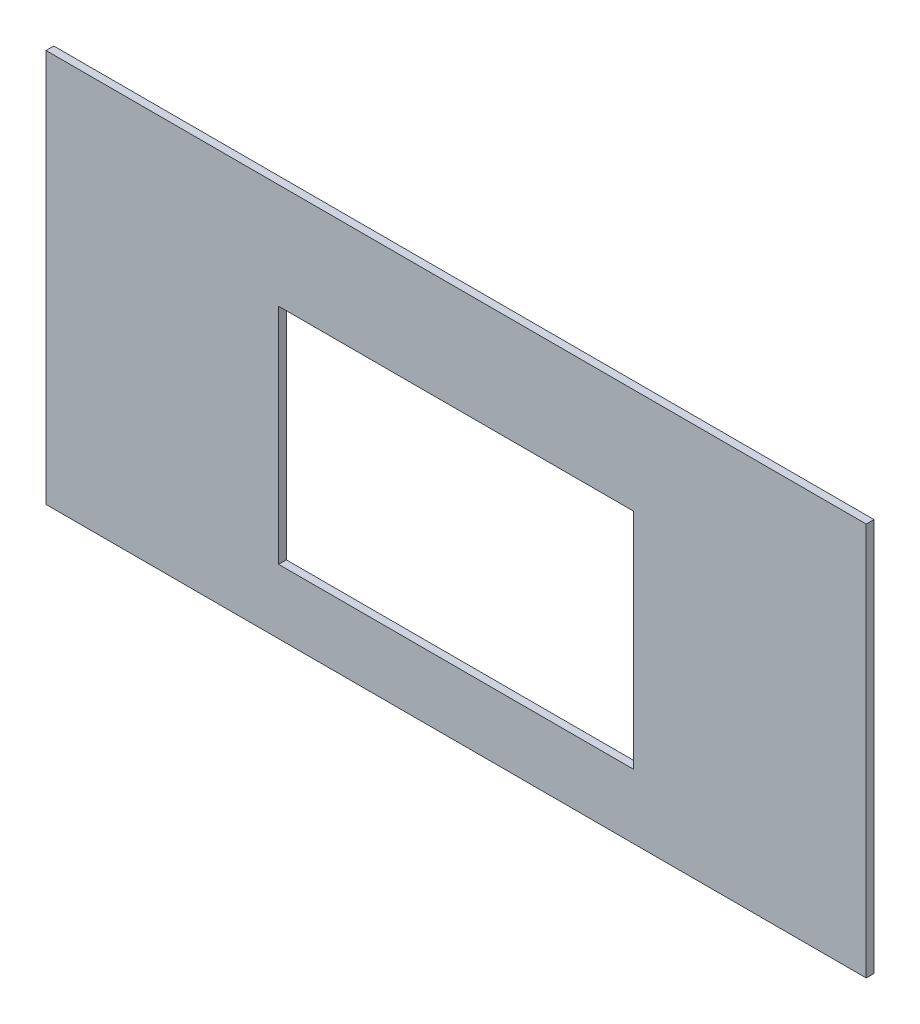
ISO-10303-21;
HEADER;
FILE_DESCRIPTION(('STEP AP214'),'2;1');
FILE_NAME('part.step','',(''),(''),'','','');
FILE_SCHEMA(('AUTOMOTIVE_DESIGN { 1 0 10303 214 1 1 1 1 }'));
ENDSEC;
DATA;
#1=APPLICATION_CONTEXT('core data for automotive mechanical design processes');
#2=APPLICATION_PROTOCOL_DEFINITION('international standard','automotive_design',2000,#1);
#3=PRODUCT_CONTEXT('',#1,'mechanical');
#4=PRODUCT('Part','Part','',(#3));
#5=PRODUCT_RELATED_PRODUCT_CATEGORY('part','',(#4));
#6=PRODUCT_DEFINITION_FORMATION('','',#4);
#7=PRODUCT_DEFINITION_CONTEXT('part definition',#1,'design');
#8=PRODUCT_DEFINITION('design','',#6,#7);
#9=PRODUCT_DEFINITION_SHAPE('','',#8);
#10=(LENGTH_UNIT() NAMED_UNIT(*) SI_UNIT(.MILLI.,.METRE.));
#11=(NAMED_UNIT(*) PLANE_ANGLE_UNIT() SI_UNIT($,.RADIAN.));
#12=(NAMED_UNIT(*) SI_UNIT($,.STERADIAN.) SOLID_ANGLE_UNIT());
#13=UNCERTAINTY_MEASURE_WITH_UNIT(LENGTH_MEASURE(1.E-05),#10,'distance_accuracy_value','');
#14=(GEOMETRIC_REPRESENTATION_CONTEXT(3) GLOBAL_UNCERTAINTY_ASSIGNED_CONTEXT((#13)) GLOBAL_UNIT_ASSIGNED_CONTEXT((#10,
#11,#12)) REPRESENTATION_CONTEXT('',''));
#15=CARTESIAN_POINT('',(0.,0.,0.));
#16=DIRECTION('',(0.,0.,1.));
#17=DIRECTION('',(1.,0.,0.));
#18=AXIS2_PLACEMENT_3D('',#15,#16,#17);
#19=CARTESIAN_POINT('',(31.19,14.95,0.59));
#20=DIRECTION('',(-1.,0.,0.));
#21=DIRECTION('',(0.,0.,1.));
#22=AXIS2_PLACEMENT_3D('',#19,#20,#21);
#23=PLANE('',#22);
#24=DIRECTION('',(0.,1.,0.));
#25=VECTOR('',#24,1.);
#26=CARTESIAN_POINT('',(31.19,14.95,0.));
#27=LINE('',#26,#25);
#28=CARTESIAN_POINT('',(31.19,-14.95,0.));
#29=VERTEX_POINT('',#28);
#30=CARTESIAN_POINT('',(31.19,14.95,0.));
#31=VERTEX_POINT('',#30);
#32=EDGE_CURVE('E123',#29,#31,#27,.T.);
#33=ORIENTED_EDGE('',*,*,#32,.T.);
#34=DIRECTION('',(0.,0.,-1.));
#35=VECTOR('',#34,1.);
#36=CARTESIAN_POINT('',(31.19,14.95,0.59));
#37=LINE('',#36,#35);
#38=CARTESIAN_POINT('',(31.19,14.95,0.59));
#39=VERTEX_POINT('',#38);
#40=EDGE_CURVE('E152',#39,#31,#37,.T.);
#41=ORIENTED_EDGE('',*,*,#40,.F.);
#42=DIRECTION('',(0.,1.,0.));
#43=VECTOR('',#42,1.);
#44=CARTESIAN_POINT('',(31.19,14.95,0.59));
#45=LINE('',#44,#43);
#46=CARTESIAN_POINT('',(31.19,-14.95,0.59));
#47=VERTEX_POINT('',#46);
#48=EDGE_CURVE('E126',#47,#39,#45,.T.);
#49=ORIENTED_EDGE('',*,*,#48,.F.);
#50=DIRECTION('',(0.,0.,-1.));
#51=VECTOR('',#50,1.);
#52=CARTESIAN_POINT('',(31.19,-14.95,0.59));
#53=LINE('',#52,#51);
#54=EDGE_CURVE('E136',#47,#29,#53,.T.);
#55=ORIENTED_EDGE('',*,*,#54,.T.);
#56=EDGE_LOOP('',(#33,#41,#49,#55));
#57=FACE_BOUND('',#56,.T.);
#58=ADVANCED_FACE('F33',(#57),#23,.F.);
#59=CARTESIAN_POINT('',(-31.19,14.95,0.59));
#60=DIRECTION('',(0.,-1.,0.));
#61=DIRECTION('',(0.,0.,-1.));
#62=AXIS2_PLACEMENT_3D('',#59,#60,#61);
#63=PLANE('',#62);
#64=DIRECTION('',(-1.,0.,0.));
#65=VECTOR('',#64,1.);
#66=CARTESIAN_POINT('',(-31.19,14.95,0.));
#67=LINE('',#66,#65);
#68=CARTESIAN_POINT('',(-31.19,14.95,0.));
#69=VERTEX_POINT('',#68);
#70=EDGE_CURVE('E139',#31,#69,#67,.T.);
#71=ORIENTED_EDGE('',*,*,#70,.T.);
#72=DIRECTION('',(0.,0.,-1.));
#73=VECTOR('',#72,1.);
#74=CARTESIAN_POINT('',(-31.19,14.95,0.59));
#75=LINE('',#74,#73);
#76=CARTESIAN_POINT('',(-31.19,14.95,0.59));
#77=VERTEX_POINT('',#76);
#78=EDGE_CURVE('E149',#77,#69,#75,.T.);
#79=ORIENTED_EDGE('',*,*,#78,.F.);
#80=DIRECTION('',(-1.,0.,0.));
#81=VECTOR('',#80,1.);
#82=CARTESIAN_POINT('',(-31.19,14.95,0.59));
#83=LINE('',#82,#81);
#84=EDGE_CURVE('E129',#39,#77,#83,.T.);
#85=ORIENTED_EDGE('',*,*,#84,.F.);
#86=ORIENTED_EDGE('',*,*,#40,.T.);
#87=EDGE_LOOP('',(#71,#79,#85,#86));
#88=FACE_BOUND('',#87,.T.);
#89=ADVANCED_FACE('F176',(#88),#63,.F.);
#90=CARTESIAN_POINT('',(-31.19,14.95,0.59));
#91=DIRECTION('',(1.,0.,0.));
#92=DIRECTION('',(0.,1.,0.));
#93=AXIS2_PLACEMENT_3D('',#90,#91,#92);
#94=PLANE('',#93);
#95=DIRECTION('',(0.,-1.,0.));
#96=VECTOR('',#95,1.);
#97=CARTESIAN_POINT('',(-31.19,14.95,0.));
#98=LINE('',#97,#96);
#99=CARTESIAN_POINT('',(-31.19,-14.95,0.));
#100=VERTEX_POINT('',#99);
#101=EDGE_CURVE('E141',#69,#100,#98,.T.);
#102=ORIENTED_EDGE('',*,*,#101,.T.);
#103=DIRECTION('',(0.,0.,-1.));
#104=VECTOR('',#103,1.);
#105=CARTESIAN_POINT('',(-31.19,-14.95,0.59));
#106=LINE('',#105,#104);
#107=CARTESIAN_POINT('',(-31.19,-14.95,0.59));
#108=VERTEX_POINT('',#107);
#109=EDGE_CURVE('E146',#108,#100,#106,.T.);
#110=ORIENTED_EDGE('',*,*,#109,.F.);
#111=DIRECTION('',(0.,-1.,0.));
#112=VECTOR('',#111,1.);
#113=CARTESIAN_POINT('',(-31.19,14.95,0.59));
#114=LINE('',#113,#112);
#115=EDGE_CURVE('E132',#77,#108,#114,.T.);
#116=ORIENTED_EDGE('',*,*,#115,.F.);
#117=ORIENTED_EDGE('',*,*,#78,.T.);
#118=EDGE_LOOP('',(#102,#110,#116,#117));
#119=FACE_BOUND('',#118,.T.);
#120=ADVANCED_FACE('F181',(#119),#94,.F.);
#121=CARTESIAN_POINT('',(-31.19,-14.95,0.59));
#122=DIRECTION('',(0.,1.,0.));
#123=DIRECTION('',(0.,0.,1.));
#124=AXIS2_PLACEMENT_3D('',#121,#122,#123);
#125=PLANE('',#124);
#126=DIRECTION('',(1.,0.,0.));
#127=VECTOR('',#126,1.);
#128=CARTESIAN_POINT('',(-31.19,-14.95,0.));
#129=LINE('',#128,#127);
#130=EDGE_CURVE('E130',#100,#29,#129,.T.);
#131=ORIENTED_EDGE('',*,*,#130,.T.);
#132=ORIENTED_EDGE('',*,*,#54,.F.);
#133=DIRECTION('',(1.,0.,0.));
#134=VECTOR('',#133,1.);
#135=CARTESIAN_POINT('',(-31.19,-14.95,0.59));
#136=LINE('',#135,#134);
#137=EDGE_CURVE('E134',#108,#47,#136,.T.);
#138=ORIENTED_EDGE('',*,*,#137,.F.);
#139=ORIENTED_EDGE('',*,*,#109,.T.);
#140=EDGE_LOOP('',(#131,#132,#138,#139));
#141=FACE_BOUND('',#140,.T.);
#142=ADVANCED_FACE('F194',(#141),#125,.F.);
#143=CARTESIAN_POINT('',(0.,0.,0.59));
#144=DIRECTION('',(0.,0.,1.));
#145=DIRECTION('',(1.,0.,0.));
#146=AXIS2_PLACEMENT_3D('',#143,#144,#145);
#147=PLANE('',#146);
#148=DIRECTION('',(0.,1.,0.));
#149=VECTOR('',#148,1.);
#150=CARTESIAN_POINT('',(13.5,6.95000000000001,0.59));
#151=LINE('',#150,#149);
#152=CARTESIAN_POINT('',(13.5,-10.05,0.59));
#153=VERTEX_POINT('',#152);
#154=CARTESIAN_POINT('',(13.5,6.95000000000001,0.59));
#155=VERTEX_POINT('',#154);
#156=EDGE_CURVE('E47',#153,#155,#151,.T.);
#157=ORIENTED_EDGE('',*,*,#156,.F.);
#158=DIRECTION('',(1.,0.,0.));
#159=VECTOR('',#158,1.);
#160=CARTESIAN_POINT('',(-13.5,-10.05,0.59));
#161=LINE('',#160,#159);
#162=CARTESIAN_POINT('',(-13.5,-10.05,0.59));
#163=VERTEX_POINT('',#162);
#164=EDGE_CURVE('E116',#163,#153,#161,.T.);
#165=ORIENTED_EDGE('',*,*,#164,.F.);
#166=DIRECTION('',(0.,-1.,0.));
#167=VECTOR('',#166,1.);
#168=CARTESIAN_POINT('',(-13.5,6.95000000000001,0.59));
#169=LINE('',#168,#167);
#170=CARTESIAN_POINT('',(-13.5,6.95000000000001,0.59));
#171=VERTEX_POINT('',#170);
#172=EDGE_CURVE('E100',#171,#163,#169,.T.);
#173=ORIENTED_EDGE('',*,*,#172,.F.);
#174=DIRECTION('',(-1.,0.,0.));
#175=VECTOR('',#174,1.);
#176=CARTESIAN_POINT('',(-13.5,6.95000000000001,0.59));
#177=LINE('',#176,#175);
#178=EDGE_CURVE('E109',#155,#171,#177,.T.);
#179=ORIENTED_EDGE('',*,*,#178,.F.);
#180=EDGE_LOOP('',(#157,#165,#173,#179));
#181=FACE_BOUND('',#180,.T.);
#182=ORIENTED_EDGE('',*,*,#48,.T.);
#183=ORIENTED_EDGE('',*,*,#84,.T.);
#184=ORIENTED_EDGE('',*,*,#115,.T.);
#185=ORIENTED_EDGE('',*,*,#137,.T.);
#186=EDGE_LOOP('',(#182,#183,#184,#185));
#187=FACE_BOUND('',#186,.T.);
#188=ADVANCED_FACE('F113',(#181,#187),#147,.T.);
#189=CARTESIAN_POINT('',(0.,0.,0.));
#190=DIRECTION('',(0.,0.,1.));
#191=DIRECTION('',(1.,0.,0.));
#192=AXIS2_PLACEMENT_3D('',#189,#190,#191);
#193=PLANE('',#192);
#194=DIRECTION('',(1.,0.,0.));
#195=VECTOR('',#194,1.);
#196=CARTESIAN_POINT('',(0.,-10.05,0.));
#197=LINE('',#196,#195);
#198=CARTESIAN_POINT('',(-13.5,-10.05,0.));
#199=VERTEX_POINT('',#198);
#200=CARTESIAN_POINT('',(13.5,-10.05,0.));
#201=VERTEX_POINT('',#200);
#202=EDGE_CURVE('E40',#199,#201,#197,.T.);
#203=ORIENTED_EDGE('',*,*,#202,.T.);
#204=DIRECTION('',(0.,1.,0.));
#205=VECTOR('',#204,1.);
#206=CARTESIAN_POINT('',(13.5,0.,0.));
#207=LINE('',#206,#205);
#208=CARTESIAN_POINT('',(13.5,6.95000000000001,0.));
#209=VERTEX_POINT('',#208);
#210=EDGE_CURVE('E11',#201,#209,#207,.T.);
#211=ORIENTED_EDGE('',*,*,#210,.T.);
#212=DIRECTION('',(-1.,0.,0.));
#213=VECTOR('',#212,1.);
#214=CARTESIAN_POINT('',(0.,6.95000000000001,0.));
#215=LINE('',#214,#213);
#216=CARTESIAN_POINT('',(-13.5,6.95000000000001,0.));
#217=VERTEX_POINT('',#216);
#218=EDGE_CURVE('E155',#209,#217,#215,.T.);
#219=ORIENTED_EDGE('',*,*,#218,.T.);
#220=DIRECTION('',(0.,-1.,0.));
#221=VECTOR('',#220,1.);
#222=CARTESIAN_POINT('',(-13.5,0.,0.));
#223=LINE('',#222,#221);
#224=EDGE_CURVE('E103',#217,#199,#223,.T.);
#225=ORIENTED_EDGE('',*,*,#224,.T.);
#226=EDGE_LOOP('',(#203,#211,#219,#225));
#227=FACE_BOUND('',#226,.T.);
#228=ORIENTED_EDGE('',*,*,#32,.F.);
#229=ORIENTED_EDGE('',*,*,#130,.F.);
#230=ORIENTED_EDGE('',*,*,#101,.F.);
#231=ORIENTED_EDGE('',*,*,#70,.F.);
#232=EDGE_LOOP('',(#228,#229,#230,#231));
#233=FACE_BOUND('',#232,.T.);
#234=ADVANCED_FACE('F159',(#227,#233),#193,.F.);
#235=CARTESIAN_POINT('',(13.5,6.95000000000001,-0.41));
#236=DIRECTION('',(1.,0.,0.));
#237=DIRECTION('',(0.,1.,0.));
#238=AXIS2_PLACEMENT_3D('',#235,#236,#237);
#239=PLANE('',#238);
#240=DIRECTION('',(0.,0.,1.));
#241=VECTOR('',#240,1.);
#242=CARTESIAN_POINT('',(13.5,-10.05,-0.41));
#243=LINE('',#242,#241);
#244=EDGE_CURVE('E121',#201,#153,#243,.T.);
#245=ORIENTED_EDGE('',*,*,#244,.T.);
#246=ORIENTED_EDGE('',*,*,#156,.T.);
#247=DIRECTION('',(0.,0.,1.));
#248=VECTOR('',#247,1.);
#249=CARTESIAN_POINT('',(13.5,6.95000000000001,-0.41));
#250=LINE('',#249,#248);
#251=EDGE_CURVE('E106',#209,#155,#250,.T.);
#252=ORIENTED_EDGE('',*,*,#251,.F.);
#253=ORIENTED_EDGE('',*,*,#210,.F.);
#254=EDGE_LOOP('',(#245,#246,#252,#253));
#255=FACE_BOUND('',#254,.T.);
#256=ADVANCED_FACE('F164',(#255),#239,.F.);
#257=CARTESIAN_POINT('',(-13.5,-10.05,-0.41));
#258=DIRECTION('',(0.,-1.,0.));
#259=DIRECTION('',(1.,0.,0.));
#260=AXIS2_PLACEMENT_3D('',#257,#258,#259);
#261=PLANE('',#260);
#262=DIRECTION('',(0.,0.,1.));
#263=VECTOR('',#262,1.);
#264=CARTESIAN_POINT('',(-13.5,-10.05,-0.41));
#265=LINE('',#264,#263);
#266=EDGE_CURVE('E105',#199,#163,#265,.T.);
#267=ORIENTED_EDGE('',*,*,#266,.T.);
#268=ORIENTED_EDGE('',*,*,#164,.T.);
#269=ORIENTED_EDGE('',*,*,#244,.F.);
#270=ORIENTED_EDGE('',*,*,#202,.F.);
#271=EDGE_LOOP('',(#267,#268,#269,#270));
#272=FACE_BOUND('',#271,.T.);
#273=ADVANCED_FACE('F163',(#272),#261,.F.);
#274=CARTESIAN_POINT('',(-13.5,6.95000000000001,-0.41));
#275=DIRECTION('',(-1.,0.,0.));
#276=DIRECTION('',(0.,0.,1.));
#277=AXIS2_PLACEMENT_3D('',#274,#275,#276);
#278=PLANE('',#277);
#279=DIRECTION('',(0.,0.,1.));
#280=VECTOR('',#279,1.);
#281=CARTESIAN_POINT('',(-13.5,6.95000000000001,-0.41));
#282=LINE('',#281,#280);
#283=EDGE_CURVE('E55',#217,#171,#282,.T.);
#284=ORIENTED_EDGE('',*,*,#283,.T.);
#285=ORIENTED_EDGE('',*,*,#172,.T.);
#286=ORIENTED_EDGE('',*,*,#266,.F.);
#287=ORIENTED_EDGE('',*,*,#224,.F.);
#288=EDGE_LOOP('',(#284,#285,#286,#287));
#289=FACE_BOUND('',#288,.T.);
#290=ADVANCED_FACE('F97',(#289),#278,.F.);
#291=CARTESIAN_POINT('',(-13.5,6.95000000000001,-0.41));
#292=DIRECTION('',(0.,1.,0.));
#293=DIRECTION('',(-1.,0.,0.));
#294=AXIS2_PLACEMENT_3D('',#291,#292,#293);
#295=PLANE('',#294);
#296=ORIENTED_EDGE('',*,*,#251,.T.);
#297=ORIENTED_EDGE('',*,*,#178,.T.);
#298=ORIENTED_EDGE('',*,*,#283,.F.);
#299=ORIENTED_EDGE('',*,*,#218,.F.);
#300=EDGE_LOOP('',(#296,#297,#298,#299));
#301=FACE_BOUND('',#300,.T.);
#302=ADVANCED_FACE('F110',(#301),#295,.F.);
#303=CLOSED_SHELL('',(#58,#89,#120,#142,#188,#234,#256,#273,#290,#302));
#304=MANIFOLD_SOLID_BREP('B2',#303);
#305=ADVANCED_BREP_SHAPE_REPRESENTATION('',(#18,#304),#14);
#306=SHAPE_DEFINITION_REPRESENTATION(#9,#305);
ENDSEC;
END-ISO-10303-21;
